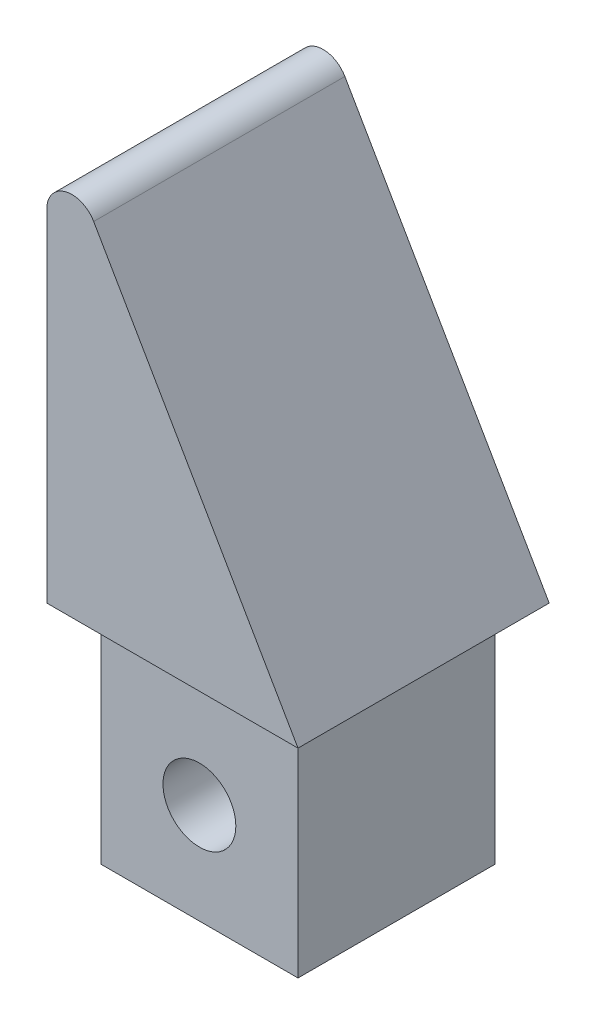
ISO-10303-21;
HEADER;
FILE_DESCRIPTION(('STEP AP214'),'2;1');
FILE_NAME('part.step','',(''),(''),'','','');
FILE_SCHEMA(('AUTOMOTIVE_DESIGN { 1 0 10303 214 1 1 1 1 }'));
ENDSEC;
DATA;
#1=APPLICATION_CONTEXT('core data for automotive mechanical design processes');
#2=APPLICATION_PROTOCOL_DEFINITION('international standard','automotive_design',2000,#1);
#3=PRODUCT_CONTEXT('',#1,'mechanical');
#4=PRODUCT('Part','Part','',(#3));
#5=PRODUCT_RELATED_PRODUCT_CATEGORY('part','',(#4));
#6=PRODUCT_DEFINITION_FORMATION('','',#4);
#7=PRODUCT_DEFINITION_CONTEXT('part definition',#1,'design');
#8=PRODUCT_DEFINITION('design','',#6,#7);
#9=PRODUCT_DEFINITION_SHAPE('','',#8);
#10=(LENGTH_UNIT() NAMED_UNIT(*) SI_UNIT(.MILLI.,.METRE.));
#11=(NAMED_UNIT(*) PLANE_ANGLE_UNIT() SI_UNIT($,.RADIAN.));
#12=(NAMED_UNIT(*) SI_UNIT($,.STERADIAN.) SOLID_ANGLE_UNIT());
#13=UNCERTAINTY_MEASURE_WITH_UNIT(LENGTH_MEASURE(1.E-05),#10,'distance_accuracy_value','');
#14=(GEOMETRIC_REPRESENTATION_CONTEXT(3) GLOBAL_UNCERTAINTY_ASSIGNED_CONTEXT((#13)) GLOBAL_UNIT_ASSIGNED_CONTEXT((#10,
#11,#12)) REPRESENTATION_CONTEXT('',''));
#15=CARTESIAN_POINT('',(0.,0.,0.));
#16=DIRECTION('',(0.,0.,1.));
#17=DIRECTION('',(1.,0.,0.));
#18=AXIS2_PLACEMENT_3D('',#15,#16,#17);
#19=CARTESIAN_POINT('',(-5.,40.,-5.));
#20=DIRECTION('',(0.,0.,1.));
#21=DIRECTION('',(1.,0.,0.));
#22=AXIS2_PLACEMENT_3D('',#19,#20,#21);
#23=PLANE('',#22);
#24=DIRECTION('',(0.,-1.,0.));
#25=VECTOR('',#24,1.);
#26=CARTESIAN_POINT('',(-5.,40.,-5.));
#27=LINE('',#26,#25);
#28=CARTESIAN_POINT('',(-5.,23.5884572681197,-5.));
#29=VERTEX_POINT('',#28);
#30=CARTESIAN_POINT('',(-5.,10.,-5.));
#31=VERTEX_POINT('',#30);
#32=EDGE_CURVE('E165',#29,#31,#27,.T.);
#33=ORIENTED_EDGE('',*,*,#32,.F.);
#34=CARTESIAN_POINT('',(-4.,23.5884572681197,-5.));
#35=DIRECTION('',(0.,0.,1.));
#36=DIRECTION('',(1.,0.,0.));
#37=AXIS2_PLACEMENT_3D('',#34,#35,#36);
#38=CIRCLE('',#37,1.);
#39=CARTESIAN_POINT('',(-3.13397459621556,24.0884572681197,-5.));
#40=VERTEX_POINT('',#39);
#41=EDGE_CURVE('E148',#29,#40,#38,.F.);
#42=ORIENTED_EDGE('',*,*,#41,.T.);
#43=DIRECTION('',(-0.500000000000004,0.866025403784436,0.));
#44=VECTOR('',#43,1.);
#45=CARTESIAN_POINT('',(-10.4903810567667,36.8301270189221,-5.));
#46=LINE('',#45,#44);
#47=CARTESIAN_POINT('',(5.,10.,-5.));
#48=VERTEX_POINT('',#47);
#49=EDGE_CURVE('E132',#48,#40,#46,.T.);
#50=ORIENTED_EDGE('',*,*,#49,.F.);
#51=DIRECTION('',(-1.,0.,0.));
#52=VECTOR('',#51,1.);
#53=CARTESIAN_POINT('',(-5.,10.,-5.));
#54=LINE('',#53,#52);
#55=EDGE_CURVE('E141',#48,#31,#54,.T.);
#56=ORIENTED_EDGE('',*,*,#55,.T.);
#57=EDGE_LOOP('',(#33,#42,#50,#56));
#58=FACE_BOUND('',#57,.T.);
#59=ADVANCED_FACE('F47',(#58),#23,.F.);
#60=CARTESIAN_POINT('',(-5.,40.,5.));
#61=DIRECTION('',(1.,0.,0.));
#62=DIRECTION('',(0.,0.,-1.));
#63=AXIS2_PLACEMENT_3D('',#60,#61,#62);
#64=PLANE('',#63);
#65=DIRECTION('',(0.,-1.,0.));
#66=VECTOR('',#65,1.);
#67=CARTESIAN_POINT('',(-5.,40.,5.));
#68=LINE('',#67,#66);
#69=CARTESIAN_POINT('',(-5.,23.5884572681197,5.));
#70=VERTEX_POINT('',#69);
#71=CARTESIAN_POINT('',(-5.,10.,5.));
#72=VERTEX_POINT('',#71);
#73=EDGE_CURVE('E162',#70,#72,#68,.T.);
#74=ORIENTED_EDGE('',*,*,#73,.F.);
#75=DIRECTION('',(0.,0.,1.));
#76=VECTOR('',#75,1.);
#77=CARTESIAN_POINT('',(-5.,23.5884572681197,-5.));
#78=LINE('',#77,#76);
#79=EDGE_CURVE('E203',#70,#29,#78,.F.);
#80=ORIENTED_EDGE('',*,*,#79,.T.);
#81=ORIENTED_EDGE('',*,*,#32,.T.);
#82=DIRECTION('',(0.,0.,1.));
#83=VECTOR('',#82,1.);
#84=CARTESIAN_POINT('',(-5.,10.,5.));
#85=LINE('',#84,#83);
#86=EDGE_CURVE('E153',#31,#72,#85,.T.);
#87=ORIENTED_EDGE('',*,*,#86,.T.);
#88=EDGE_LOOP('',(#74,#80,#81,#87));
#89=FACE_BOUND('',#88,.T.);
#90=ADVANCED_FACE('F290',(#89),#64,.F.);
#91=CARTESIAN_POINT('',(-5.,40.,5.));
#92=DIRECTION('',(0.,0.,-1.));
#93=DIRECTION('',(-1.,0.,0.));
#94=AXIS2_PLACEMENT_3D('',#91,#92,#93);
#95=PLANE('',#94);
#96=DIRECTION('',(-0.500000000000004,0.866025403784436,0.));
#97=VECTOR('',#96,1.);
#98=CARTESIAN_POINT('',(8.0801270189222,4.66506350946115,5.));
#99=LINE('',#98,#97);
#100=CARTESIAN_POINT('',(5.,10.,5.));
#101=VERTEX_POINT('',#100);
#102=CARTESIAN_POINT('',(-3.13397459621556,24.0884572681197,5.));
#103=VERTEX_POINT('',#102);
#104=EDGE_CURVE('E135',#101,#103,#99,.T.);
#105=ORIENTED_EDGE('',*,*,#104,.T.);
#106=CARTESIAN_POINT('',(-4.,23.5884572681197,5.));
#107=DIRECTION('',(0.,0.,-1.));
#108=DIRECTION('',(-1.,0.,0.));
#109=AXIS2_PLACEMENT_3D('',#106,#107,#108);
#110=CIRCLE('',#109,1.);
#111=EDGE_CURVE('E200',#103,#70,#110,.F.);
#112=ORIENTED_EDGE('',*,*,#111,.T.);
#113=ORIENTED_EDGE('',*,*,#73,.T.);
#114=DIRECTION('',(1.,0.,0.));
#115=VECTOR('',#114,1.);
#116=CARTESIAN_POINT('',(-5.,10.,5.));
#117=LINE('',#116,#115);
#118=EDGE_CURVE('E157',#72,#101,#117,.T.);
#119=ORIENTED_EDGE('',*,*,#118,.T.);
#120=EDGE_LOOP('',(#105,#112,#113,#119));
#121=FACE_BOUND('',#120,.T.);
#122=ADVANCED_FACE('F296',(#121),#95,.F.);
#123=CARTESIAN_POINT('',(3.925,10.,3.925));
#124=DIRECTION('',(-1.,0.,0.));
#125=DIRECTION('',(0.,0.,1.));
#126=AXIS2_PLACEMENT_3D('',#123,#124,#125);
#127=PLANE('',#126);
#128=DIRECTION('',(0.,-1.,0.));
#129=VECTOR('',#128,1.);
#130=CARTESIAN_POINT('',(3.925,10.,3.925));
#131=LINE('',#130,#129);
#132=CARTESIAN_POINT('',(3.925,10.,3.925));
#133=VERTEX_POINT('',#132);
#134=CARTESIAN_POINT('',(3.925,0.999999999999997,3.925));
#135=VERTEX_POINT('',#134);
#136=EDGE_CURVE('E184',#133,#135,#131,.T.);
#137=ORIENTED_EDGE('',*,*,#136,.T.);
#138=DIRECTION('',(0.,0.,-1.));
#139=VECTOR('',#138,1.);
#140=CARTESIAN_POINT('',(3.925,0.999999999999997,-3.925));
#141=LINE('',#140,#139);
#142=CARTESIAN_POINT('',(3.925,0.999999999999997,-3.925));
#143=VERTEX_POINT('',#142);
#144=EDGE_CURVE('E11',#135,#143,#141,.T.);
#145=ORIENTED_EDGE('',*,*,#144,.T.);
#146=DIRECTION('',(0.,-1.,0.));
#147=VECTOR('',#146,1.);
#148=CARTESIAN_POINT('',(3.925,10.,-3.925));
#149=LINE('',#148,#147);
#150=CARTESIAN_POINT('',(3.925,10.,-3.925));
#151=VERTEX_POINT('',#150);
#152=EDGE_CURVE('E193',#151,#143,#149,.T.);
#153=ORIENTED_EDGE('',*,*,#152,.F.);
#154=DIRECTION('',(0.,0.,-1.));
#155=VECTOR('',#154,1.);
#156=CARTESIAN_POINT('',(3.925,10.,3.925));
#157=LINE('',#156,#155);
#158=EDGE_CURVE('E168',#133,#151,#157,.T.);
#159=ORIENTED_EDGE('',*,*,#158,.F.);
#160=EDGE_LOOP('',(#137,#145,#153,#159));
#161=FACE_BOUND('',#160,.T.);
#162=ADVANCED_FACE('F276',(#161),#127,.F.);
#163=CARTESIAN_POINT('',(-3.925,10.,-3.925));
#164=DIRECTION('',(0.,0.,1.));
#165=DIRECTION('',(1.,0.,0.));
#166=AXIS2_PLACEMENT_3D('',#163,#164,#165);
#167=PLANE('',#166);
#168=CARTESIAN_POINT('',(0.,5.,-3.925));
#169=DIRECTION('',(0.,0.,1.));
#170=DIRECTION('',(1.,0.,0.));
#171=AXIS2_PLACEMENT_3D('',#168,#169,#170);
#172=CIRCLE('',#171,1.45);
#173=CARTESIAN_POINT('',(1.45,5.,-3.925));
#174=VERTEX_POINT('',#173);
#175=EDGE_CURVE('E233',#174,#174,#172,.T.);
#176=ORIENTED_EDGE('',*,*,#175,.T.);
#177=EDGE_LOOP('',(#176));
#178=FACE_BOUND('',#177,.T.);
#179=ORIENTED_EDGE('',*,*,#152,.T.);
#180=DIRECTION('',(-1.,0.,0.));
#181=VECTOR('',#180,1.);
#182=CARTESIAN_POINT('',(-3.925,0.999999999999997,-3.925));
#183=LINE('',#182,#181);
#184=CARTESIAN_POINT('',(-3.925,0.999999999999997,-3.925));
#185=VERTEX_POINT('',#184);
#186=EDGE_CURVE('E208',#143,#185,#183,.T.);
#187=ORIENTED_EDGE('',*,*,#186,.T.);
#188=DIRECTION('',(0.,-1.,0.));
#189=VECTOR('',#188,1.);
#190=CARTESIAN_POINT('',(-3.925,10.,-3.925));
#191=LINE('',#190,#189);
#192=CARTESIAN_POINT('',(-3.925,10.,-3.925));
#193=VERTEX_POINT('',#192);
#194=EDGE_CURVE('E190',#193,#185,#191,.T.);
#195=ORIENTED_EDGE('',*,*,#194,.F.);
#196=DIRECTION('',(-1.,0.,0.));
#197=VECTOR('',#196,1.);
#198=CARTESIAN_POINT('',(-3.925,10.,-3.925));
#199=LINE('',#198,#197);
#200=EDGE_CURVE('E172',#151,#193,#199,.T.);
#201=ORIENTED_EDGE('',*,*,#200,.F.);
#202=EDGE_LOOP('',(#179,#187,#195,#201));
#203=FACE_BOUND('',#202,.T.);
#204=ADVANCED_FACE('F278',(#178,#203),#167,.F.);
#205=CARTESIAN_POINT('',(-3.925,10.,3.925));
#206=DIRECTION('',(1.,0.,0.));
#207=DIRECTION('',(0.,0.,-1.));
#208=AXIS2_PLACEMENT_3D('',#205,#206,#207);
#209=PLANE('',#208);
#210=ORIENTED_EDGE('',*,*,#194,.T.);
#211=DIRECTION('',(0.,0.,1.));
#212=VECTOR('',#211,1.);
#213=CARTESIAN_POINT('',(-3.925,0.999999999999997,3.925));
#214=LINE('',#213,#212);
#215=CARTESIAN_POINT('',(-3.925,0.999999999999997,3.925));
#216=VERTEX_POINT('',#215);
#217=EDGE_CURVE('E73',#185,#216,#214,.T.);
#218=ORIENTED_EDGE('',*,*,#217,.T.);
#219=DIRECTION('',(0.,-1.,0.));
#220=VECTOR('',#219,1.);
#221=CARTESIAN_POINT('',(-3.925,10.,3.925));
#222=LINE('',#221,#220);
#223=CARTESIAN_POINT('',(-3.925,10.,3.925));
#224=VERTEX_POINT('',#223);
#225=EDGE_CURVE('E187',#224,#216,#222,.T.);
#226=ORIENTED_EDGE('',*,*,#225,.F.);
#227=DIRECTION('',(0.,0.,1.));
#228=VECTOR('',#227,1.);
#229=CARTESIAN_POINT('',(-3.925,10.,3.925));
#230=LINE('',#229,#228);
#231=EDGE_CURVE('E176',#193,#224,#230,.T.);
#232=ORIENTED_EDGE('',*,*,#231,.F.);
#233=EDGE_LOOP('',(#210,#218,#226,#232));
#234=FACE_BOUND('',#233,.T.);
#235=ADVANCED_FACE('F265',(#234),#209,.F.);
#236=CARTESIAN_POINT('',(-3.925,10.,3.925));
#237=DIRECTION('',(0.,0.,-1.));
#238=DIRECTION('',(-1.,0.,0.));
#239=AXIS2_PLACEMENT_3D('',#236,#237,#238);
#240=PLANE('',#239);
#241=CARTESIAN_POINT('',(0.,5.,3.925));
#242=DIRECTION('',(0.,0.,1.));
#243=DIRECTION('',(1.,0.,0.));
#244=AXIS2_PLACEMENT_3D('',#241,#242,#243);
#245=CIRCLE('',#244,1.45);
#246=CARTESIAN_POINT('',(1.45,5.,3.925));
#247=VERTEX_POINT('',#246);
#248=EDGE_CURVE('E254',#247,#247,#245,.T.);
#249=ORIENTED_EDGE('',*,*,#248,.F.);
#250=EDGE_LOOP('',(#249));
#251=FACE_BOUND('',#250,.T.);
#252=ORIENTED_EDGE('',*,*,#225,.T.);
#253=DIRECTION('',(1.,0.,0.));
#254=VECTOR('',#253,1.);
#255=CARTESIAN_POINT('',(3.925,0.999999999999997,3.925));
#256=LINE('',#255,#254);
#257=EDGE_CURVE('E58',#216,#135,#256,.T.);
#258=ORIENTED_EDGE('',*,*,#257,.T.);
#259=ORIENTED_EDGE('',*,*,#136,.F.);
#260=DIRECTION('',(1.,0.,0.));
#261=VECTOR('',#260,1.);
#262=CARTESIAN_POINT('',(-3.925,10.,3.925));
#263=LINE('',#262,#261);
#264=EDGE_CURVE('E180',#224,#133,#263,.T.);
#265=ORIENTED_EDGE('',*,*,#264,.F.);
#266=EDGE_LOOP('',(#252,#258,#259,#265));
#267=FACE_BOUND('',#266,.T.);
#268=ADVANCED_FACE('F262',(#251,#267),#240,.F.);
#269=CARTESIAN_POINT('',(0.,0.,0.));
#270=DIRECTION('',(0.,-1.,0.));
#271=DIRECTION('',(0.,0.,-1.));
#272=AXIS2_PLACEMENT_3D('',#269,#270,#271);
#273=PLANE('',#272);
#274=DIRECTION('',(0.,0.,-1.));
#275=VECTOR('',#274,1.);
#276=CARTESIAN_POINT('',(-2.925,0.,-3.925));
#277=LINE('',#276,#275);
#278=CARTESIAN_POINT('',(-2.925,0.,2.925));
#279=VERTEX_POINT('',#278);
#280=CARTESIAN_POINT('',(-2.925,0.,-2.925));
#281=VERTEX_POINT('',#280);
#282=EDGE_CURVE('E218',#279,#281,#277,.T.);
#283=ORIENTED_EDGE('',*,*,#282,.T.);
#284=DIRECTION('',(1.,0.,0.));
#285=VECTOR('',#284,1.);
#286=CARTESIAN_POINT('',(3.925,0.,-2.925));
#287=LINE('',#286,#285);
#288=CARTESIAN_POINT('',(2.925,0.,-2.925));
#289=VERTEX_POINT('',#288);
#290=EDGE_CURVE('E221',#281,#289,#287,.T.);
#291=ORIENTED_EDGE('',*,*,#290,.T.);
#292=DIRECTION('',(0.,0.,1.));
#293=VECTOR('',#292,1.);
#294=CARTESIAN_POINT('',(2.925,0.,3.925));
#295=LINE('',#294,#293);
#296=CARTESIAN_POINT('',(2.925,0.,2.925));
#297=VERTEX_POINT('',#296);
#298=EDGE_CURVE('E212',#289,#297,#295,.T.);
#299=ORIENTED_EDGE('',*,*,#298,.T.);
#300=DIRECTION('',(-1.,0.,0.));
#301=VECTOR('',#300,1.);
#302=CARTESIAN_POINT('',(-3.925,0.,2.925));
#303=LINE('',#302,#301);
#304=EDGE_CURVE('E215',#297,#279,#303,.T.);
#305=ORIENTED_EDGE('',*,*,#304,.T.);
#306=EDGE_LOOP('',(#283,#291,#299,#305));
#307=FACE_BOUND('',#306,.T.);
#308=ADVANCED_FACE('F264',(#307),#273,.T.);
#309=CARTESIAN_POINT('',(0.,10.,0.));
#310=DIRECTION('',(0.,-1.,0.));
#311=DIRECTION('',(0.,0.,-1.));
#312=AXIS2_PLACEMENT_3D('',#309,#310,#311);
#313=PLANE('',#312);
#314=ORIENTED_EDGE('',*,*,#264,.T.);
#315=ORIENTED_EDGE('',*,*,#158,.T.);
#316=ORIENTED_EDGE('',*,*,#200,.T.);
#317=ORIENTED_EDGE('',*,*,#231,.T.);
#318=EDGE_LOOP('',(#314,#315,#316,#317));
#319=FACE_BOUND('',#318,.T.);
#320=DIRECTION('',(0.,0.,-1.));
#321=VECTOR('',#320,1.);
#322=CARTESIAN_POINT('',(5.,10.,5.));
#323=LINE('',#322,#321);
#324=EDGE_CURVE('E128',#101,#48,#323,.T.);
#325=ORIENTED_EDGE('',*,*,#324,.F.);
#326=ORIENTED_EDGE('',*,*,#118,.F.);
#327=ORIENTED_EDGE('',*,*,#86,.F.);
#328=ORIENTED_EDGE('',*,*,#55,.F.);
#329=EDGE_LOOP('',(#325,#326,#327,#328));
#330=FACE_BOUND('',#329,.T.);
#331=ADVANCED_FACE('F151',(#319,#330),#313,.T.);
#332=CARTESIAN_POINT('',(8.0801270189222,4.66506350946115,-25.));
#333=DIRECTION('',(0.866025403784436,0.500000000000004,0.));
#334=DIRECTION('',(-0.500000000000004,0.866025403784436,0.));
#335=AXIS2_PLACEMENT_3D('',#332,#333,#334);
#336=PLANE('',#335);
#337=ORIENTED_EDGE('',*,*,#49,.T.);
#338=DIRECTION('',(0.,0.,1.));
#339=VECTOR('',#338,1.);
#340=CARTESIAN_POINT('',(-3.13397459621556,24.0884572681197,5.));
#341=LINE('',#340,#339);
#342=EDGE_CURVE('E197',#40,#103,#341,.T.);
#343=ORIENTED_EDGE('',*,*,#342,.T.);
#344=ORIENTED_EDGE('',*,*,#104,.F.);
#345=ORIENTED_EDGE('',*,*,#324,.T.);
#346=EDGE_LOOP('',(#337,#343,#344,#345));
#347=FACE_BOUND('',#346,.T.);
#348=ADVANCED_FACE('F130',(#347),#336,.T.);
#349=CARTESIAN_POINT('',(-4.,23.5884572681197,-25.));
#350=DIRECTION('',(0.,0.,-1.));
#351=DIRECTION('',(-1.,0.,0.));
#352=AXIS2_PLACEMENT_3D('',#349,#350,#351);
#353=CYLINDRICAL_SURFACE('',#352,1.);
#354=ORIENTED_EDGE('',*,*,#41,.F.);
#355=ORIENTED_EDGE('',*,*,#79,.F.);
#356=ORIENTED_EDGE('',*,*,#111,.F.);
#357=ORIENTED_EDGE('',*,*,#342,.F.);
#358=EDGE_LOOP('',(#354,#355,#356,#357));
#359=FACE_BOUND('',#358,.T.);
#360=ADVANCED_FACE('F330',(#359),#353,.T.);
#361=CARTESIAN_POINT('',(-3.925,0.999999999999997,3.925));
#362=DIRECTION('',(0.,-0.707106781186549,0.707106781186546));
#363=DIRECTION('',(-1.,0.,0.));
#364=AXIS2_PLACEMENT_3D('',#361,#362,#363);
#365=PLANE('',#364);
#366=DIRECTION('',(0.577350269189627,-0.577350269189624,-0.577350269189627));
#367=VECTOR('',#366,1.);
#368=CARTESIAN_POINT('',(-3.925,0.999999999999997,3.925));
#369=LINE('',#368,#367);
#370=EDGE_CURVE('E235',#279,#216,#369,.F.);
#371=ORIENTED_EDGE('',*,*,#370,.F.);
#372=ORIENTED_EDGE('',*,*,#304,.F.);
#373=DIRECTION('',(-0.577350269189627,-0.577350269189624,-0.577350269189627));
#374=VECTOR('',#373,1.);
#375=CARTESIAN_POINT('',(3.925,0.999999999999997,3.925));
#376=LINE('',#375,#374);
#377=EDGE_CURVE('E52',#135,#297,#376,.T.);
#378=ORIENTED_EDGE('',*,*,#377,.F.);
#379=ORIENTED_EDGE('',*,*,#257,.F.);
#380=EDGE_LOOP('',(#371,#372,#378,#379));
#381=FACE_BOUND('',#380,.T.);
#382=ADVANCED_FACE('F50',(#381),#365,.T.);
#383=CARTESIAN_POINT('',(3.925,0.999999999999997,3.925));
#384=DIRECTION('',(0.707106781186546,-0.707106781186549,0.));
#385=DIRECTION('',(0.,0.,1.));
#386=AXIS2_PLACEMENT_3D('',#383,#384,#385);
#387=PLANE('',#386);
#388=ORIENTED_EDGE('',*,*,#377,.T.);
#389=ORIENTED_EDGE('',*,*,#298,.F.);
#390=DIRECTION('',(0.577350269189627,0.577350269189624,-0.577350269189627));
#391=VECTOR('',#390,1.);
#392=CARTESIAN_POINT('',(1.30833333333333,-1.61666666666667,-1.30833333333333));
#393=LINE('',#392,#391);
#394=EDGE_CURVE('E232',#143,#289,#393,.F.);
#395=ORIENTED_EDGE('',*,*,#394,.F.);
#396=ORIENTED_EDGE('',*,*,#144,.F.);
#397=EDGE_LOOP('',(#388,#389,#395,#396));
#398=FACE_BOUND('',#397,.T.);
#399=ADVANCED_FACE('F272',(#398),#387,.T.);
#400=CARTESIAN_POINT('',(-3.925,0.999999999999997,3.925));
#401=DIRECTION('',(-0.707106781186546,-0.707106781186549,0.));
#402=DIRECTION('',(0.,0.,-1.));
#403=AXIS2_PLACEMENT_3D('',#400,#401,#402);
#404=PLANE('',#403);
#405=ORIENTED_EDGE('',*,*,#370,.T.);
#406=ORIENTED_EDGE('',*,*,#217,.F.);
#407=DIRECTION('',(0.577350269189627,-0.577350269189624,0.577350269189627));
#408=VECTOR('',#407,1.);
#409=CARTESIAN_POINT('',(-1.30833333333333,-1.61666666666667,-1.30833333333333));
#410=LINE('',#409,#408);
#411=EDGE_CURVE('E229',#281,#185,#410,.F.);
#412=ORIENTED_EDGE('',*,*,#411,.F.);
#413=ORIENTED_EDGE('',*,*,#282,.F.);
#414=EDGE_LOOP('',(#405,#406,#412,#413));
#415=FACE_BOUND('',#414,.T.);
#416=ADVANCED_FACE('F310',(#415),#404,.T.);
#417=CARTESIAN_POINT('',(-3.925,0.999999999999997,-3.925));
#418=DIRECTION('',(0.,-0.707106781186549,-0.707106781186546));
#419=DIRECTION('',(1.,0.,0.));
#420=AXIS2_PLACEMENT_3D('',#417,#418,#419);
#421=PLANE('',#420);
#422=ORIENTED_EDGE('',*,*,#394,.T.);
#423=ORIENTED_EDGE('',*,*,#290,.F.);
#424=ORIENTED_EDGE('',*,*,#411,.T.);
#425=ORIENTED_EDGE('',*,*,#186,.F.);
#426=EDGE_LOOP('',(#422,#423,#424,#425));
#427=FACE_BOUND('',#426,.T.);
#428=ADVANCED_FACE('F309',(#427),#421,.T.);
#429=CARTESIAN_POINT('',(0.,5.,-26.075));
#430=DIRECTION('',(0.,0.,1.));
#431=DIRECTION('',(1.,0.,0.));
#432=AXIS2_PLACEMENT_3D('',#429,#430,#431);
#433=CYLINDRICAL_SURFACE('',#432,1.45);
#434=ORIENTED_EDGE('',*,*,#248,.T.);
#435=EDGE_LOOP('',(#434));
#436=FACE_BOUND('',#435,.T.);
#437=ORIENTED_EDGE('',*,*,#175,.F.);
#438=EDGE_LOOP('',(#437));
#439=FACE_BOUND('',#438,.T.);
#440=ADVANCED_FACE('F259',(#436,#439),#433,.F.);
#441=CLOSED_SHELL('',(#59,#90,#122,#162,#204,#235,#268,#308,#331,#348,#360,#382,#399,#416,#428,#440));
#442=MANIFOLD_SOLID_BREP('B2',#441);
#443=ADVANCED_BREP_SHAPE_REPRESENTATION('',(#18,#442),#14);
#444=SHAPE_DEFINITION_REPRESENTATION(#9,#443);
ENDSEC;
END-ISO-10303-21;
